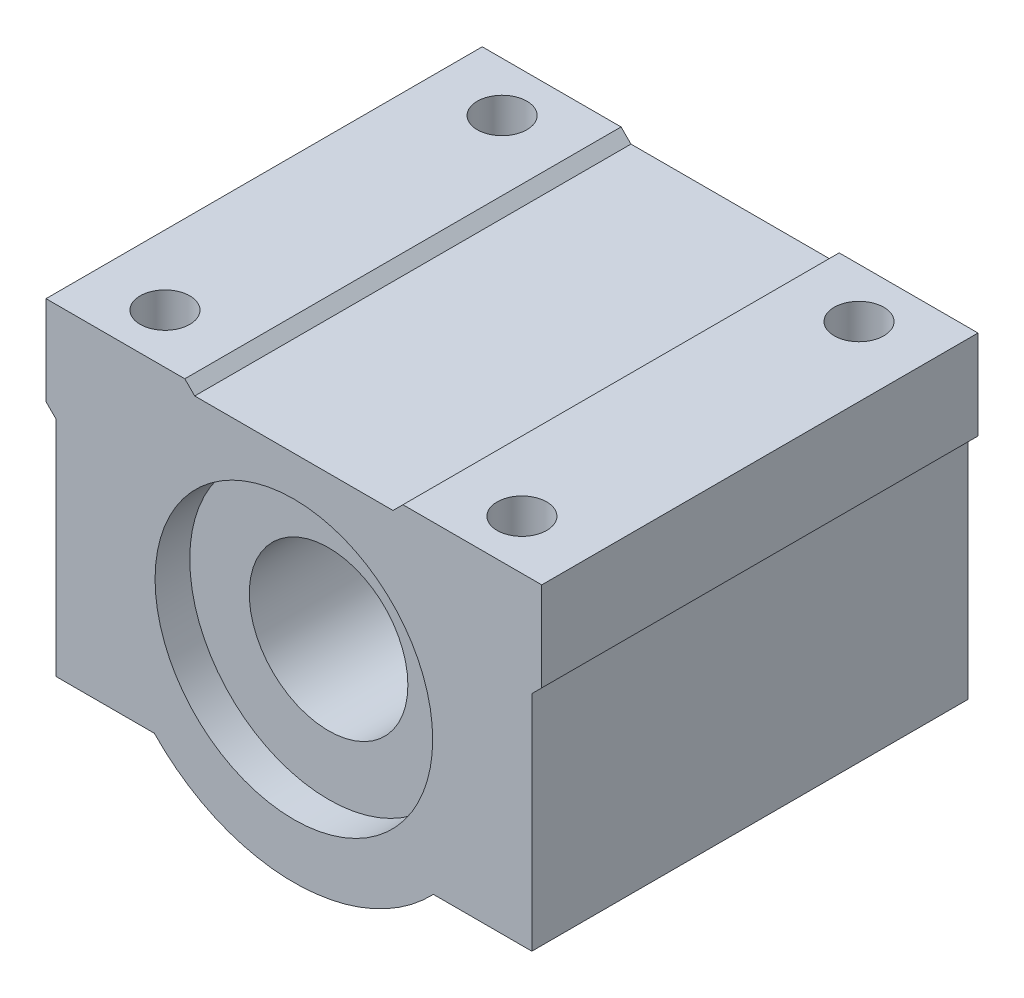
ISO-10303-21;
HEADER;
FILE_DESCRIPTION(('STEP AP214'),'2;1');
FILE_NAME('part.step','',(''),(''),'','','');
FILE_SCHEMA(('AUTOMOTIVE_DESIGN { 1 0 10303 214 1 1 1 1 }'));
ENDSEC;
DATA;
#1=APPLICATION_CONTEXT('core data for automotive mechanical design processes');
#2=APPLICATION_PROTOCOL_DEFINITION('international standard','automotive_design',2000,#1);
#3=PRODUCT_CONTEXT('',#1,'mechanical');
#4=PRODUCT('Part','Part','',(#3));
#5=PRODUCT_RELATED_PRODUCT_CATEGORY('part','',(#4));
#6=PRODUCT_DEFINITION_FORMATION('','',#4);
#7=PRODUCT_DEFINITION_CONTEXT('part definition',#1,'design');
#8=PRODUCT_DEFINITION('design','',#6,#7);
#9=PRODUCT_DEFINITION_SHAPE('','',#8);
#10=(LENGTH_UNIT() NAMED_UNIT(*) SI_UNIT(.MILLI.,.METRE.));
#11=(NAMED_UNIT(*) PLANE_ANGLE_UNIT() SI_UNIT($,.RADIAN.));
#12=(NAMED_UNIT(*) SI_UNIT($,.STERADIAN.) SOLID_ANGLE_UNIT());
#13=UNCERTAINTY_MEASURE_WITH_UNIT(LENGTH_MEASURE(1.E-05),#10,'distance_accuracy_value','');
#14=(GEOMETRIC_REPRESENTATION_CONTEXT(3) GLOBAL_UNCERTAINTY_ASSIGNED_CONTEXT((#13)) GLOBAL_UNIT_ASSIGNED_CONTEXT((#10,
#11,#12)) REPRESENTATION_CONTEXT('',''));
#15=CARTESIAN_POINT('',(0.,0.,0.));
#16=DIRECTION('',(0.,0.,1.));
#17=DIRECTION('',(1.,0.,0.));
#18=AXIS2_PLACEMENT_3D('',#15,#16,#17);
#19=CARTESIAN_POINT('',(9.29116685898119,22.1984733505311,18.5));
#20=DIRECTION('',(-0.707106781186548,0.707106781186548,0.));
#21=DIRECTION('',(-0.707106781186548,-0.707106781186548,0.));
#22=AXIS2_PLACEMENT_3D('',#19,#20,#21);
#23=PLANE('',#22);
#24=DIRECTION('',(-0.707106781186548,-0.707106781186548,0.));
#25=VECTOR('',#24,1.);
#26=CARTESIAN_POINT('',(9.29116685898119,22.1984733505311,-3.50000000000001));
#27=LINE('',#26,#25);
#28=CARTESIAN_POINT('',(10.2911668589812,23.1984733505311,-3.5));
#29=VERTEX_POINT('',#28);
#30=CARTESIAN_POINT('',(9.2911668589812,22.1984733505311,-3.50000000000001));
#31=VERTEX_POINT('',#30);
#32=EDGE_CURVE('E112',#29,#31,#27,.T.);
#33=ORIENTED_EDGE('',*,*,#32,.T.);
#34=DIRECTION('',(0.,0.,1.));
#35=VECTOR('',#34,1.);
#36=CARTESIAN_POINT('',(9.29116685898119,22.1984733505311,18.5));
#37=LINE('',#36,#35);
#38=CARTESIAN_POINT('',(9.2911668589812,22.1984733505311,40.5));
#39=VERTEX_POINT('',#38);
#40=EDGE_CURVE('E116',#39,#31,#37,.F.);
#41=ORIENTED_EDGE('',*,*,#40,.F.);
#42=DIRECTION('',(-0.707106781186548,-0.707106781186548,0.));
#43=VECTOR('',#42,1.);
#44=CARTESIAN_POINT('',(9.29116685898119,22.1984733505311,40.5));
#45=LINE('',#44,#43);
#46=CARTESIAN_POINT('',(10.2911668589812,23.1984733505311,40.5));
#47=VERTEX_POINT('',#46);
#48=EDGE_CURVE('E124',#39,#47,#45,.F.);
#49=ORIENTED_EDGE('',*,*,#48,.T.);
#50=DIRECTION('',(0.,0.,1.));
#51=VECTOR('',#50,1.);
#52=CARTESIAN_POINT('',(10.2911668589812,23.1984733505311,18.5));
#53=LINE('',#52,#51);
#54=EDGE_CURVE('E119',#29,#47,#53,.T.);
#55=ORIENTED_EDGE('',*,*,#54,.F.);
#56=EDGE_LOOP('',(#33,#41,#49,#55));
#57=FACE_BOUND('',#56,.T.);
#58=ADVANCED_FACE('F17',(#57),#23,.T.);
#59=CARTESIAN_POINT('',(-11.7088331410188,23.1984733505311,18.5));
#60=DIRECTION('',(0.707106781186546,0.707106781186549,0.));
#61=DIRECTION('',(-0.707106781186549,0.707106781186546,0.));
#62=AXIS2_PLACEMENT_3D('',#59,#60,#61);
#63=PLANE('',#62);
#64=DIRECTION('',(-0.707106781186549,0.707106781186546,0.));
#65=VECTOR('',#64,1.);
#66=CARTESIAN_POINT('',(-11.7088331410188,23.1984733505311,-3.5));
#67=LINE('',#66,#65);
#68=CARTESIAN_POINT('',(-10.7088331410188,22.1984733505311,-3.5));
#69=VERTEX_POINT('',#68);
#70=CARTESIAN_POINT('',(-11.7088331410188,23.1984733505311,-3.5));
#71=VERTEX_POINT('',#70);
#72=EDGE_CURVE('E138',#69,#71,#67,.T.);
#73=ORIENTED_EDGE('',*,*,#72,.T.);
#74=DIRECTION('',(0.,0.,1.));
#75=VECTOR('',#74,1.);
#76=CARTESIAN_POINT('',(-11.7088331410188,23.1984733505311,18.5));
#77=LINE('',#76,#75);
#78=CARTESIAN_POINT('',(-11.7088331410188,23.1984733505311,40.5));
#79=VERTEX_POINT('',#78);
#80=EDGE_CURVE('E183',#79,#71,#77,.F.);
#81=ORIENTED_EDGE('',*,*,#80,.F.);
#82=DIRECTION('',(-0.707106781186549,0.707106781186546,0.));
#83=VECTOR('',#82,1.);
#84=CARTESIAN_POINT('',(-11.7088331410188,23.1984733505311,40.5));
#85=LINE('',#84,#83);
#86=CARTESIAN_POINT('',(-10.7088331410188,22.1984733505311,40.5));
#87=VERTEX_POINT('',#86);
#88=EDGE_CURVE('E123',#79,#87,#85,.F.);
#89=ORIENTED_EDGE('',*,*,#88,.T.);
#90=DIRECTION('',(0.,0.,1.));
#91=VECTOR('',#90,1.);
#92=CARTESIAN_POINT('',(-10.7088331410188,22.1984733505311,18.5));
#93=LINE('',#92,#91);
#94=EDGE_CURVE('E133',#69,#87,#93,.T.);
#95=ORIENTED_EDGE('',*,*,#94,.F.);
#96=EDGE_LOOP('',(#73,#81,#89,#95));
#97=FACE_BOUND('',#96,.T.);
#98=ADVANCED_FACE('F397',(#97),#63,.T.);
#99=CARTESIAN_POINT('',(-24.7088331410188,13.1984733505311,18.5));
#100=DIRECTION('',(-0.707106781186543,-0.707106781186552,0.));
#101=DIRECTION('',(0.707106781186552,-0.707106781186543,0.));
#102=AXIS2_PLACEMENT_3D('',#99,#100,#101);
#103=PLANE('',#102);
#104=DIRECTION('',(0.707106781186552,-0.707106781186543,0.));
#105=VECTOR('',#104,1.);
#106=CARTESIAN_POINT('',(-24.7088331410188,13.1984733505311,-3.5));
#107=LINE('',#106,#105);
#108=CARTESIAN_POINT('',(-25.7088331410188,14.1984733505311,-3.5));
#109=VERTEX_POINT('',#108);
#110=CARTESIAN_POINT('',(-24.7088331410188,13.1984733505311,-3.5));
#111=VERTEX_POINT('',#110);
#112=EDGE_CURVE('E211',#109,#111,#107,.T.);
#113=ORIENTED_EDGE('',*,*,#112,.T.);
#114=DIRECTION('',(0.,0.,1.));
#115=VECTOR('',#114,1.);
#116=CARTESIAN_POINT('',(-24.7088331410188,13.1984733505311,18.5));
#117=LINE('',#116,#115);
#118=CARTESIAN_POINT('',(-24.7088331410188,13.1984733505311,40.5));
#119=VERTEX_POINT('',#118);
#120=EDGE_CURVE('E166',#119,#111,#117,.F.);
#121=ORIENTED_EDGE('',*,*,#120,.F.);
#122=DIRECTION('',(0.707106781186552,-0.707106781186543,0.));
#123=VECTOR('',#122,1.);
#124=CARTESIAN_POINT('',(-24.7088331410188,13.1984733505311,40.5));
#125=LINE('',#124,#123);
#126=CARTESIAN_POINT('',(-25.7088331410188,14.1984733505311,40.5));
#127=VERTEX_POINT('',#126);
#128=EDGE_CURVE('E212',#119,#127,#125,.F.);
#129=ORIENTED_EDGE('',*,*,#128,.T.);
#130=DIRECTION('',(0.,0.,1.));
#131=VECTOR('',#130,1.);
#132=CARTESIAN_POINT('',(-25.7088331410188,14.1984733505311,18.5));
#133=LINE('',#132,#131);
#134=EDGE_CURVE('E177',#109,#127,#133,.T.);
#135=ORIENTED_EDGE('',*,*,#134,.F.);
#136=EDGE_LOOP('',(#113,#121,#129,#135));
#137=FACE_BOUND('',#136,.T.);
#138=ADVANCED_FACE('F386',(#137),#103,.T.);
#139=CARTESIAN_POINT('',(-18.7088331410188,6.94847335053108,35.5));
#140=DIRECTION('',(0.,1.,0.));
#141=DIRECTION('',(0.,0.,1.));
#142=AXIS2_PLACEMENT_3D('',#139,#140,#141);
#143=CYLINDRICAL_SURFACE('',#142,2.5);
#144=CARTESIAN_POINT('',(-18.7088331410188,-9.30152664946892,35.5));
#145=DIRECTION('',(0.,1.,0.));
#146=DIRECTION('',(0.,0.,1.));
#147=AXIS2_PLACEMENT_3D('',#144,#145,#146);
#148=CIRCLE('',#147,2.5);
#149=CARTESIAN_POINT('',(-18.7088331410188,-9.30152664946892,38.));
#150=VERTEX_POINT('',#149);
#151=EDGE_CURVE('E165',#150,#150,#148,.T.);
#152=ORIENTED_EDGE('',*,*,#151,.F.);
#153=EDGE_LOOP('',(#152));
#154=FACE_BOUND('',#153,.T.);
#155=CARTESIAN_POINT('',(-18.7088331410188,23.1984733505311,35.5));
#156=DIRECTION('',(0.,1.,0.));
#157=DIRECTION('',(0.,0.,1.));
#158=AXIS2_PLACEMENT_3D('',#155,#156,#157);
#159=CIRCLE('',#158,2.5);
#160=CARTESIAN_POINT('',(-18.7088331410188,23.1984733505311,38.));
#161=VERTEX_POINT('',#160);
#162=EDGE_CURVE('E186',#161,#161,#159,.F.);
#163=ORIENTED_EDGE('',*,*,#162,.F.);
#164=EDGE_LOOP('',(#163));
#165=FACE_BOUND('',#164,.T.);
#166=ADVANCED_FACE('F287',(#154,#165),#143,.F.);
#167=CARTESIAN_POINT('',(-18.7088331410188,6.94847335053108,1.5));
#168=DIRECTION('',(0.,1.,0.));
#169=DIRECTION('',(0.,0.,1.));
#170=AXIS2_PLACEMENT_3D('',#167,#168,#169);
#171=CYLINDRICAL_SURFACE('',#170,2.5);
#172=CARTESIAN_POINT('',(-18.7088331410188,-9.30152664946892,1.5));
#173=DIRECTION('',(0.,1.,0.));
#174=DIRECTION('',(0.,0.,1.));
#175=AXIS2_PLACEMENT_3D('',#172,#173,#174);
#176=CIRCLE('',#175,2.5);
#177=CARTESIAN_POINT('',(-18.7088331410188,-9.30152664946892,4.));
#178=VERTEX_POINT('',#177);
#179=EDGE_CURVE('E162',#178,#178,#176,.T.);
#180=ORIENTED_EDGE('',*,*,#179,.F.);
#181=EDGE_LOOP('',(#180));
#182=FACE_BOUND('',#181,.T.);
#183=CARTESIAN_POINT('',(-18.7088331410188,23.1984733505311,1.5));
#184=DIRECTION('',(0.,1.,0.));
#185=DIRECTION('',(0.,0.,1.));
#186=AXIS2_PLACEMENT_3D('',#183,#184,#185);
#187=CIRCLE('',#186,2.5);
#188=CARTESIAN_POINT('',(-18.7088331410188,23.1984733505311,4.));
#189=VERTEX_POINT('',#188);
#190=EDGE_CURVE('E182',#189,#189,#187,.F.);
#191=ORIENTED_EDGE('',*,*,#190,.F.);
#192=EDGE_LOOP('',(#191));
#193=FACE_BOUND('',#192,.T.);
#194=ADVANCED_FACE('F276',(#182,#193),#171,.F.);
#195=CARTESIAN_POINT('',(17.2911668589812,6.94847335053109,1.5));
#196=DIRECTION('',(0.,1.,0.));
#197=DIRECTION('',(-1.,0.,0.));
#198=AXIS2_PLACEMENT_3D('',#195,#196,#197);
#199=CYLINDRICAL_SURFACE('',#198,2.5);
#200=CARTESIAN_POINT('',(17.2911668589812,-9.30152664946891,1.5));
#201=DIRECTION('',(0.,1.,0.));
#202=DIRECTION('',(-1.,0.,0.));
#203=AXIS2_PLACEMENT_3D('',#200,#201,#202);
#204=CIRCLE('',#203,2.5);
#205=CARTESIAN_POINT('',(14.7911668589812,-9.30152664946891,1.5));
#206=VERTEX_POINT('',#205);
#207=EDGE_CURVE('E151',#206,#206,#204,.T.);
#208=ORIENTED_EDGE('',*,*,#207,.F.);
#209=EDGE_LOOP('',(#208));
#210=FACE_BOUND('',#209,.T.);
#211=CARTESIAN_POINT('',(17.2911668589812,23.1984733505311,1.5));
#212=DIRECTION('',(0.,1.,0.));
#213=DIRECTION('',(-1.,0.,0.));
#214=AXIS2_PLACEMENT_3D('',#211,#212,#213);
#215=CIRCLE('',#214,2.5);
#216=CARTESIAN_POINT('',(14.7911668589812,23.1984733505311,1.5));
#217=VERTEX_POINT('',#216);
#218=EDGE_CURVE('E20',#217,#217,#215,.F.);
#219=ORIENTED_EDGE('',*,*,#218,.F.);
#220=EDGE_LOOP('',(#219));
#221=FACE_BOUND('',#220,.T.);
#222=ADVANCED_FACE('F273',(#210,#221),#199,.F.);
#223=CARTESIAN_POINT('',(17.2911668589812,6.94847335053109,35.5));
#224=DIRECTION('',(0.,1.,0.));
#225=DIRECTION('',(-1.,0.,0.));
#226=AXIS2_PLACEMENT_3D('',#223,#224,#225);
#227=CYLINDRICAL_SURFACE('',#226,2.5);
#228=CARTESIAN_POINT('',(17.2911668589812,-9.30152664946891,35.5));
#229=DIRECTION('',(0.,1.,0.));
#230=DIRECTION('',(-1.,0.,0.));
#231=AXIS2_PLACEMENT_3D('',#228,#229,#230);
#232=CIRCLE('',#231,2.5);
#233=CARTESIAN_POINT('',(14.7911668589812,-9.30152664946891,35.5));
#234=VERTEX_POINT('',#233);
#235=EDGE_CURVE('E153',#234,#234,#232,.T.);
#236=ORIENTED_EDGE('',*,*,#235,.F.);
#237=EDGE_LOOP('',(#236));
#238=FACE_BOUND('',#237,.T.);
#239=CARTESIAN_POINT('',(17.2911668589812,23.1984733505311,35.5));
#240=DIRECTION('',(0.,1.,0.));
#241=DIRECTION('',(-1.,0.,0.));
#242=AXIS2_PLACEMENT_3D('',#239,#240,#241);
#243=CIRCLE('',#242,2.5);
#244=CARTESIAN_POINT('',(14.7911668589812,23.1984733505311,35.5));
#245=VERTEX_POINT('',#244);
#246=EDGE_CURVE('E134',#245,#245,#243,.F.);
#247=ORIENTED_EDGE('',*,*,#246,.F.);
#248=EDGE_LOOP('',(#247));
#249=FACE_BOUND('',#248,.T.);
#250=ADVANCED_FACE('F275',(#238,#249),#227,.F.);
#251=CARTESIAN_POINT('',(24.2911668589812,14.1984733505311,18.5));
#252=DIRECTION('',(0.707106781186549,-0.707106781186546,0.));
#253=DIRECTION('',(0.707106781186546,0.707106781186549,0.));
#254=AXIS2_PLACEMENT_3D('',#251,#252,#253);
#255=PLANE('',#254);
#256=DIRECTION('',(0.707106781186546,0.707106781186549,0.));
#257=VECTOR('',#256,1.);
#258=CARTESIAN_POINT('',(24.2911668589812,14.1984733505311,-3.5));
#259=LINE('',#258,#257);
#260=CARTESIAN_POINT('',(23.2911668589812,13.1984733505311,-3.5));
#261=VERTEX_POINT('',#260);
#262=CARTESIAN_POINT('',(24.2911668589812,14.1984733505311,-3.5));
#263=VERTEX_POINT('',#262);
#264=EDGE_CURVE('E91',#261,#263,#259,.T.);
#265=ORIENTED_EDGE('',*,*,#264,.T.);
#266=DIRECTION('',(0.,0.,-1.));
#267=VECTOR('',#266,1.);
#268=CARTESIAN_POINT('',(24.2911668589812,14.1984733505311,18.5));
#269=LINE('',#268,#267);
#270=CARTESIAN_POINT('',(24.2911668589812,14.1984733505311,40.5));
#271=VERTEX_POINT('',#270);
#272=EDGE_CURVE('E192',#271,#263,#269,.T.);
#273=ORIENTED_EDGE('',*,*,#272,.F.);
#274=DIRECTION('',(0.707106781186546,0.707106781186549,0.));
#275=VECTOR('',#274,1.);
#276=CARTESIAN_POINT('',(24.2911668589812,14.1984733505311,40.5));
#277=LINE('',#276,#275);
#278=CARTESIAN_POINT('',(23.2911668589812,13.1984733505311,40.5));
#279=VERTEX_POINT('',#278);
#280=EDGE_CURVE('E208',#271,#279,#277,.F.);
#281=ORIENTED_EDGE('',*,*,#280,.T.);
#282=DIRECTION('',(0.,0.,-1.));
#283=VECTOR('',#282,1.);
#284=CARTESIAN_POINT('',(23.2911668589812,13.1984733505311,18.5));
#285=LINE('',#284,#283);
#286=EDGE_CURVE('E141',#261,#279,#285,.F.);
#287=ORIENTED_EDGE('',*,*,#286,.F.);
#288=EDGE_LOOP('',(#265,#273,#281,#287));
#289=FACE_BOUND('',#288,.T.);
#290=ADVANCED_FACE('F284',(#289),#255,.T.);
#291=CARTESIAN_POINT('',(24.2911668589812,23.1984733505311,18.5));
#292=DIRECTION('',(1.,0.,0.));
#293=DIRECTION('',(0.,0.,-1.));
#294=AXIS2_PLACEMENT_3D('',#291,#292,#293);
#295=PLANE('',#294);
#296=DIRECTION('',(0.,1.,0.));
#297=VECTOR('',#296,1.);
#298=CARTESIAN_POINT('',(24.2911668589812,6.14233781535583,-3.5));
#299=LINE('',#298,#297);
#300=CARTESIAN_POINT('',(24.2911668589812,23.1984733505311,-3.5));
#301=VERTEX_POINT('',#300);
#302=EDGE_CURVE('E197',#263,#301,#299,.T.);
#303=ORIENTED_EDGE('',*,*,#302,.T.);
#304=DIRECTION('',(0.,0.,1.));
#305=VECTOR('',#304,1.);
#306=CARTESIAN_POINT('',(24.2911668589812,23.1984733505311,18.5));
#307=LINE('',#306,#305);
#308=CARTESIAN_POINT('',(24.2911668589812,23.1984733505311,40.5));
#309=VERTEX_POINT('',#308);
#310=EDGE_CURVE('E189',#309,#301,#307,.F.);
#311=ORIENTED_EDGE('',*,*,#310,.F.);
#312=DIRECTION('',(0.,1.,0.));
#313=VECTOR('',#312,1.);
#314=CARTESIAN_POINT('',(24.2911668589812,6.14233781535582,40.5));
#315=LINE('',#314,#313);
#316=EDGE_CURVE('E367',#271,#309,#315,.T.);
#317=ORIENTED_EDGE('',*,*,#316,.F.);
#318=ORIENTED_EDGE('',*,*,#272,.T.);
#319=EDGE_LOOP('',(#303,#311,#317,#318));
#320=FACE_BOUND('',#319,.T.);
#321=ADVANCED_FACE('F353',(#320),#295,.T.);
#322=CARTESIAN_POINT('',(10.2911668589812,23.1984733505311,18.5));
#323=DIRECTION('',(0.,1.,0.));
#324=DIRECTION('',(0.,0.,1.));
#325=AXIS2_PLACEMENT_3D('',#322,#323,#324);
#326=PLANE('',#325);
#327=ORIENTED_EDGE('',*,*,#246,.T.);
#328=EDGE_LOOP('',(#327));
#329=FACE_BOUND('',#328,.T.);
#330=ORIENTED_EDGE('',*,*,#218,.T.);
#331=EDGE_LOOP('',(#330));
#332=FACE_BOUND('',#331,.T.);
#333=DIRECTION('',(1.,0.,0.));
#334=VECTOR('',#333,1.);
#335=CARTESIAN_POINT('',(-0.708833141018809,23.1984733505311,-3.5));
#336=LINE('',#335,#334);
#337=EDGE_CURVE('E368',#301,#29,#336,.F.);
#338=ORIENTED_EDGE('',*,*,#337,.T.);
#339=ORIENTED_EDGE('',*,*,#54,.T.);
#340=DIRECTION('',(1.,0.,0.));
#341=VECTOR('',#340,1.);
#342=CARTESIAN_POINT('',(-0.708833141018808,23.1984733505311,40.5));
#343=LINE('',#342,#341);
#344=EDGE_CURVE('E415',#309,#47,#343,.F.);
#345=ORIENTED_EDGE('',*,*,#344,.F.);
#346=ORIENTED_EDGE('',*,*,#310,.T.);
#347=EDGE_LOOP('',(#338,#339,#345,#346));
#348=FACE_BOUND('',#347,.T.);
#349=ADVANCED_FACE('F270',(#329,#332,#348),#326,.T.);
#350=CARTESIAN_POINT('',(-10.7088331410188,22.1984733505311,18.5));
#351=DIRECTION('',(0.,1.,0.));
#352=DIRECTION('',(0.,0.,1.));
#353=AXIS2_PLACEMENT_3D('',#350,#351,#352);
#354=PLANE('',#353);
#355=DIRECTION('',(1.,0.,0.));
#356=VECTOR('',#355,1.);
#357=CARTESIAN_POINT('',(-0.708833141018809,22.1984733505311,-3.5));
#358=LINE('',#357,#356);
#359=EDGE_CURVE('E130',#31,#69,#358,.F.);
#360=ORIENTED_EDGE('',*,*,#359,.T.);
#361=ORIENTED_EDGE('',*,*,#94,.T.);
#362=DIRECTION('',(1.,0.,0.));
#363=VECTOR('',#362,1.);
#364=CARTESIAN_POINT('',(-0.708833141018808,22.1984733505311,40.5));
#365=LINE('',#364,#363);
#366=EDGE_CURVE('E132',#39,#87,#365,.F.);
#367=ORIENTED_EDGE('',*,*,#366,.F.);
#368=ORIENTED_EDGE('',*,*,#40,.T.);
#369=EDGE_LOOP('',(#360,#361,#367,#368));
#370=FACE_BOUND('',#369,.T.);
#371=ADVANCED_FACE('F128',(#370),#354,.T.);
#372=CARTESIAN_POINT('',(-25.7088331410188,23.1984733505311,18.5));
#373=DIRECTION('',(0.,1.,0.));
#374=DIRECTION('',(0.,0.,1.));
#375=AXIS2_PLACEMENT_3D('',#372,#373,#374);
#376=PLANE('',#375);
#377=ORIENTED_EDGE('',*,*,#190,.T.);
#378=EDGE_LOOP('',(#377));
#379=FACE_BOUND('',#378,.T.);
#380=ORIENTED_EDGE('',*,*,#162,.T.);
#381=EDGE_LOOP('',(#380));
#382=FACE_BOUND('',#381,.T.);
#383=DIRECTION('',(1.,0.,0.));
#384=VECTOR('',#383,1.);
#385=CARTESIAN_POINT('',(-0.708833141018809,23.1984733505311,-3.5));
#386=LINE('',#385,#384);
#387=CARTESIAN_POINT('',(-25.7088331410188,23.1984733505311,-3.5));
#388=VERTEX_POINT('',#387);
#389=EDGE_CURVE('E140',#71,#388,#386,.F.);
#390=ORIENTED_EDGE('',*,*,#389,.T.);
#391=DIRECTION('',(0.,0.,1.));
#392=VECTOR('',#391,1.);
#393=CARTESIAN_POINT('',(-25.7088331410188,23.1984733505311,18.5));
#394=LINE('',#393,#392);
#395=CARTESIAN_POINT('',(-25.7088331410188,23.1984733505311,40.5));
#396=VERTEX_POINT('',#395);
#397=EDGE_CURVE('E180',#396,#388,#394,.F.);
#398=ORIENTED_EDGE('',*,*,#397,.F.);
#399=DIRECTION('',(1.,0.,0.));
#400=VECTOR('',#399,1.);
#401=CARTESIAN_POINT('',(-0.708833141018808,23.1984733505311,40.5));
#402=LINE('',#401,#400);
#403=EDGE_CURVE('E233',#79,#396,#402,.F.);
#404=ORIENTED_EDGE('',*,*,#403,.F.);
#405=ORIENTED_EDGE('',*,*,#80,.T.);
#406=EDGE_LOOP('',(#390,#398,#404,#405));
#407=FACE_BOUND('',#406,.T.);
#408=ADVANCED_FACE('F344',(#379,#382,#407),#376,.T.);
#409=CARTESIAN_POINT('',(-25.7088331410188,14.1984733505311,18.5));
#410=DIRECTION('',(-1.,0.,0.));
#411=DIRECTION('',(0.,0.,1.));
#412=AXIS2_PLACEMENT_3D('',#409,#410,#411);
#413=PLANE('',#412);
#414=DIRECTION('',(0.,1.,0.));
#415=VECTOR('',#414,1.);
#416=CARTESIAN_POINT('',(-25.7088331410188,6.14233781535583,-3.5));
#417=LINE('',#416,#415);
#418=EDGE_CURVE('E144',#388,#109,#417,.F.);
#419=ORIENTED_EDGE('',*,*,#418,.T.);
#420=ORIENTED_EDGE('',*,*,#134,.T.);
#421=DIRECTION('',(0.,1.,0.));
#422=VECTOR('',#421,1.);
#423=CARTESIAN_POINT('',(-25.7088331410188,6.14233781535582,40.5));
#424=LINE('',#423,#422);
#425=EDGE_CURVE('E172',#396,#127,#424,.F.);
#426=ORIENTED_EDGE('',*,*,#425,.F.);
#427=ORIENTED_EDGE('',*,*,#397,.T.);
#428=EDGE_LOOP('',(#419,#420,#426,#427));
#429=FACE_BOUND('',#428,.T.);
#430=ADVANCED_FACE('F340',(#429),#413,.T.);
#431=CARTESIAN_POINT('',(-24.7088331410188,-9.30152664946893,18.5));
#432=DIRECTION('',(-1.,0.,0.));
#433=DIRECTION('',(0.,0.,1.));
#434=AXIS2_PLACEMENT_3D('',#431,#432,#433);
#435=PLANE('',#434);
#436=DIRECTION('',(0.,1.,0.));
#437=VECTOR('',#436,1.);
#438=CARTESIAN_POINT('',(-24.7088331410188,6.14233781535583,-3.5));
#439=LINE('',#438,#437);
#440=CARTESIAN_POINT('',(-24.7088331410188,-9.30152664946892,-3.5));
#441=VERTEX_POINT('',#440);
#442=EDGE_CURVE('E201',#111,#441,#439,.F.);
#443=ORIENTED_EDGE('',*,*,#442,.T.);
#444=DIRECTION('',(0.,0.,-1.));
#445=VECTOR('',#444,1.);
#446=CARTESIAN_POINT('',(-24.7088331410188,-9.30152664946892,18.5));
#447=LINE('',#446,#445);
#448=CARTESIAN_POINT('',(-24.7088331410188,-9.30152664946893,40.5));
#449=VERTEX_POINT('',#448);
#450=EDGE_CURVE('E163',#449,#441,#447,.T.);
#451=ORIENTED_EDGE('',*,*,#450,.F.);
#452=DIRECTION('',(0.,1.,0.));
#453=VECTOR('',#452,1.);
#454=CARTESIAN_POINT('',(-24.7088331410188,6.14233781535582,40.5));
#455=LINE('',#454,#453);
#456=EDGE_CURVE('E169',#119,#449,#455,.F.);
#457=ORIENTED_EDGE('',*,*,#456,.F.);
#458=ORIENTED_EDGE('',*,*,#120,.T.);
#459=EDGE_LOOP('',(#443,#451,#457,#458));
#460=FACE_BOUND('',#459,.T.);
#461=ADVANCED_FACE('F336',(#460),#435,.T.);
#462=CARTESIAN_POINT('',(-14.7800804204891,-9.30152664946892,18.5));
#463=DIRECTION('',(0.,-1.,0.));
#464=DIRECTION('',(0.,0.,-1.));
#465=AXIS2_PLACEMENT_3D('',#462,#463,#464);
#466=PLANE('',#465);
#467=ORIENTED_EDGE('',*,*,#179,.T.);
#468=EDGE_LOOP('',(#467));
#469=FACE_BOUND('',#468,.T.);
#470=ORIENTED_EDGE('',*,*,#151,.T.);
#471=EDGE_LOOP('',(#470));
#472=FACE_BOUND('',#471,.T.);
#473=DIRECTION('',(1.,0.,0.));
#474=VECTOR('',#473,1.);
#475=CARTESIAN_POINT('',(-0.708833141018809,-9.30152664946892,-3.5));
#476=LINE('',#475,#474);
#477=CARTESIAN_POINT('',(-14.7800804204891,-9.30152664946893,-3.5));
#478=VERTEX_POINT('',#477);
#479=EDGE_CURVE('E204',#441,#478,#476,.T.);
#480=ORIENTED_EDGE('',*,*,#479,.T.);
#481=DIRECTION('',(0.,0.,1.));
#482=VECTOR('',#481,1.);
#483=CARTESIAN_POINT('',(-14.7800804204891,-9.30152664946893,18.5));
#484=LINE('',#483,#482);
#485=CARTESIAN_POINT('',(-14.7800804204891,-9.30152664946893,40.5));
#486=VERTEX_POINT('',#485);
#487=EDGE_CURVE('E70',#486,#478,#484,.F.);
#488=ORIENTED_EDGE('',*,*,#487,.F.);
#489=DIRECTION('',(1.,0.,0.));
#490=VECTOR('',#489,1.);
#491=CARTESIAN_POINT('',(-0.708833141018808,-9.30152664946893,40.5));
#492=LINE('',#491,#490);
#493=EDGE_CURVE('E171',#449,#486,#492,.T.);
#494=ORIENTED_EDGE('',*,*,#493,.F.);
#495=ORIENTED_EDGE('',*,*,#450,.T.);
#496=EDGE_LOOP('',(#480,#488,#494,#495));
#497=FACE_BOUND('',#496,.T.);
#498=ADVANCED_FACE('F333',(#469,#472,#497),#466,.T.);
#499=CARTESIAN_POINT('',(-0.708833141018808,4.19847335053108,18.5));
#500=DIRECTION('',(0.,0.,1.));
#501=DIRECTION('',(1.,0.,0.));
#502=AXIS2_PLACEMENT_3D('',#499,#500,#501);
#503=CYLINDRICAL_SURFACE('',#502,19.5);
#504=CARTESIAN_POINT('',(-0.708833141018808,4.19847335053108,-3.5));
#505=DIRECTION('',(0.,0.,1.));
#506=DIRECTION('',(1.,0.,0.));
#507=AXIS2_PLACEMENT_3D('',#504,#505,#506);
#508=CIRCLE('',#507,19.5);
#509=CARTESIAN_POINT('',(13.3624141384515,-9.30152664946891,-3.5));
#510=VERTEX_POINT('',#509);
#511=EDGE_CURVE('E251',#478,#510,#508,.T.);
#512=ORIENTED_EDGE('',*,*,#511,.T.);
#513=DIRECTION('',(0.,0.,-1.));
#514=VECTOR('',#513,1.);
#515=CARTESIAN_POINT('',(13.3624141384515,-9.30152664946891,18.5));
#516=LINE('',#515,#514);
#517=CARTESIAN_POINT('',(13.3624141384515,-9.30152664946891,40.5));
#518=VERTEX_POINT('',#517);
#519=EDGE_CURVE('E76',#518,#510,#516,.T.);
#520=ORIENTED_EDGE('',*,*,#519,.F.);
#521=CARTESIAN_POINT('',(-0.708833141018808,4.19847335053108,40.5));
#522=DIRECTION('',(0.,0.,1.));
#523=DIRECTION('',(1.,0.,0.));
#524=AXIS2_PLACEMENT_3D('',#521,#522,#523);
#525=CIRCLE('',#524,19.5);
#526=EDGE_CURVE('E249',#486,#518,#525,.T.);
#527=ORIENTED_EDGE('',*,*,#526,.F.);
#528=ORIENTED_EDGE('',*,*,#487,.T.);
#529=EDGE_LOOP('',(#512,#520,#527,#528));
#530=FACE_BOUND('',#529,.T.);
#531=ADVANCED_FACE('F329',(#530),#503,.T.);
#532=CARTESIAN_POINT('',(23.2911668589812,-9.30152664946891,18.5));
#533=DIRECTION('',(0.,-1.,0.));
#534=DIRECTION('',(0.,0.,-1.));
#535=AXIS2_PLACEMENT_3D('',#532,#533,#534);
#536=PLANE('',#535);
#537=ORIENTED_EDGE('',*,*,#235,.T.);
#538=EDGE_LOOP('',(#537));
#539=FACE_BOUND('',#538,.T.);
#540=ORIENTED_EDGE('',*,*,#207,.T.);
#541=EDGE_LOOP('',(#540));
#542=FACE_BOUND('',#541,.T.);
#543=DIRECTION('',(1.,0.,0.));
#544=VECTOR('',#543,1.);
#545=CARTESIAN_POINT('',(-0.708833141018809,-9.30152664946891,-3.5));
#546=LINE('',#545,#544);
#547=CARTESIAN_POINT('',(23.2911668589812,-9.30152664946891,-3.5));
#548=VERTEX_POINT('',#547);
#549=EDGE_CURVE('E198',#510,#548,#546,.T.);
#550=ORIENTED_EDGE('',*,*,#549,.T.);
#551=DIRECTION('',(0.,0.,-1.));
#552=VECTOR('',#551,1.);
#553=CARTESIAN_POINT('',(23.2911668589812,-9.30152664946891,18.5));
#554=LINE('',#553,#552);
#555=CARTESIAN_POINT('',(23.2911668589812,-9.30152664946892,40.5));
#556=VERTEX_POINT('',#555);
#557=EDGE_CURVE('E83',#556,#548,#554,.T.);
#558=ORIENTED_EDGE('',*,*,#557,.F.);
#559=DIRECTION('',(1.,0.,0.));
#560=VECTOR('',#559,1.);
#561=CARTESIAN_POINT('',(-0.708833141018808,-9.30152664946892,40.5));
#562=LINE('',#561,#560);
#563=EDGE_CURVE('E35',#518,#556,#562,.T.);
#564=ORIENTED_EDGE('',*,*,#563,.F.);
#565=ORIENTED_EDGE('',*,*,#519,.T.);
#566=EDGE_LOOP('',(#550,#558,#564,#565));
#567=FACE_BOUND('',#566,.T.);
#568=ADVANCED_FACE('F326',(#539,#542,#567),#536,.T.);
#569=CARTESIAN_POINT('',(23.2911668589812,13.1984733505311,18.5));
#570=DIRECTION('',(1.,0.,0.));
#571=DIRECTION('',(0.,0.,-1.));
#572=AXIS2_PLACEMENT_3D('',#569,#570,#571);
#573=PLANE('',#572);
#574=DIRECTION('',(0.,1.,0.));
#575=VECTOR('',#574,1.);
#576=CARTESIAN_POINT('',(23.2911668589812,6.14233781535583,-3.5));
#577=LINE('',#576,#575);
#578=EDGE_CURVE('E195',#548,#261,#577,.T.);
#579=ORIENTED_EDGE('',*,*,#578,.T.);
#580=ORIENTED_EDGE('',*,*,#286,.T.);
#581=DIRECTION('',(0.,1.,0.));
#582=VECTOR('',#581,1.);
#583=CARTESIAN_POINT('',(23.2911668589812,6.14233781535582,40.5));
#584=LINE('',#583,#582);
#585=EDGE_CURVE('E156',#556,#279,#584,.T.);
#586=ORIENTED_EDGE('',*,*,#585,.F.);
#587=ORIENTED_EDGE('',*,*,#557,.T.);
#588=EDGE_LOOP('',(#579,#580,#586,#587));
#589=FACE_BOUND('',#588,.T.);
#590=ADVANCED_FACE('F322',(#589),#573,.T.);
#591=CARTESIAN_POINT('',(-0.708833141018809,6.14233781535583,-3.5));
#592=DIRECTION('',(0.,0.,1.));
#593=DIRECTION('',(1.,0.,0.));
#594=AXIS2_PLACEMENT_3D('',#591,#592,#593);
#595=PLANE('',#594);
#596=CARTESIAN_POINT('',(-0.708833141018808,4.19847335053108,-3.5));
#597=DIRECTION('',(0.,0.,1.));
#598=DIRECTION('',(1.,0.,0.));
#599=AXIS2_PLACEMENT_3D('',#596,#597,#598);
#600=CIRCLE('',#599,14.);
#601=CARTESIAN_POINT('',(13.2911668589812,4.19847335053108,-3.5));
#602=VERTEX_POINT('',#601);
#603=EDGE_CURVE('E158',#602,#602,#600,.T.);
#604=ORIENTED_EDGE('',*,*,#603,.T.);
#605=EDGE_LOOP('',(#604));
#606=FACE_BOUND('',#605,.T.);
#607=ORIENTED_EDGE('',*,*,#302,.F.);
#608=ORIENTED_EDGE('',*,*,#264,.F.);
#609=ORIENTED_EDGE('',*,*,#578,.F.);
#610=ORIENTED_EDGE('',*,*,#549,.F.);
#611=ORIENTED_EDGE('',*,*,#511,.F.);
#612=ORIENTED_EDGE('',*,*,#479,.F.);
#613=ORIENTED_EDGE('',*,*,#442,.F.);
#614=ORIENTED_EDGE('',*,*,#112,.F.);
#615=ORIENTED_EDGE('',*,*,#418,.F.);
#616=ORIENTED_EDGE('',*,*,#389,.F.);
#617=ORIENTED_EDGE('',*,*,#72,.F.);
#618=ORIENTED_EDGE('',*,*,#359,.F.);
#619=ORIENTED_EDGE('',*,*,#32,.F.);
#620=ORIENTED_EDGE('',*,*,#337,.F.);
#621=EDGE_LOOP('',(#607,#608,#609,#610,#611,#612,#613,#614,#615,#616,#617,#618,#619,#620));
#622=FACE_BOUND('',#621,.T.);
#623=ADVANCED_FACE('F136',(#606,#622),#595,.F.);
#624=CARTESIAN_POINT('',(-0.708833141018808,6.14233781535582,40.5));
#625=DIRECTION('',(0.,0.,1.));
#626=DIRECTION('',(1.,0.,0.));
#627=AXIS2_PLACEMENT_3D('',#624,#625,#626);
#628=PLANE('',#627);
#629=CARTESIAN_POINT('',(-0.708833141018808,4.19847335053108,40.5));
#630=DIRECTION('',(0.,0.,1.));
#631=DIRECTION('',(1.,0.,0.));
#632=AXIS2_PLACEMENT_3D('',#629,#630,#631);
#633=CIRCLE('',#632,14.);
#634=CARTESIAN_POINT('',(13.2911668589812,4.19847335053108,40.5));
#635=VERTEX_POINT('',#634);
#636=EDGE_CURVE('E244',#635,#635,#633,.F.);
#637=ORIENTED_EDGE('',*,*,#636,.T.);
#638=EDGE_LOOP('',(#637));
#639=FACE_BOUND('',#638,.T.);
#640=ORIENTED_EDGE('',*,*,#563,.T.);
#641=ORIENTED_EDGE('',*,*,#585,.T.);
#642=ORIENTED_EDGE('',*,*,#280,.F.);
#643=ORIENTED_EDGE('',*,*,#316,.T.);
#644=ORIENTED_EDGE('',*,*,#344,.T.);
#645=ORIENTED_EDGE('',*,*,#48,.F.);
#646=ORIENTED_EDGE('',*,*,#366,.T.);
#647=ORIENTED_EDGE('',*,*,#88,.F.);
#648=ORIENTED_EDGE('',*,*,#403,.T.);
#649=ORIENTED_EDGE('',*,*,#425,.T.);
#650=ORIENTED_EDGE('',*,*,#128,.F.);
#651=ORIENTED_EDGE('',*,*,#456,.T.);
#652=ORIENTED_EDGE('',*,*,#493,.T.);
#653=ORIENTED_EDGE('',*,*,#526,.T.);
#654=EDGE_LOOP('',(#640,#641,#642,#643,#644,#645,#646,#647,#648,#649,#650,#651,#652,#653));
#655=FACE_BOUND('',#654,.T.);
#656=ADVANCED_FACE('F315',(#639,#655),#628,.T.);
#657=CARTESIAN_POINT('',(-0.708833141018808,4.19847335053108,18.5));
#658=DIRECTION('',(0.,0.,1.));
#659=DIRECTION('',(1.,0.,0.));
#660=AXIS2_PLACEMENT_3D('',#657,#658,#659);
#661=CYLINDRICAL_SURFACE('',#660,14.);
#662=CARTESIAN_POINT('',(-0.708833141018808,4.19847335053108,0.));
#663=DIRECTION('',(0.,0.,1.));
#664=DIRECTION('',(1.,0.,0.));
#665=AXIS2_PLACEMENT_3D('',#662,#663,#664);
#666=CIRCLE('',#665,14.);
#667=CARTESIAN_POINT('',(13.2911668589812,4.19847335053108,0.));
#668=VERTEX_POINT('',#667);
#669=EDGE_CURVE('E241',#668,#668,#666,.F.);
#670=ORIENTED_EDGE('',*,*,#669,.F.);
#671=EDGE_LOOP('',(#670));
#672=FACE_BOUND('',#671,.T.);
#673=ORIENTED_EDGE('',*,*,#603,.F.);
#674=EDGE_LOOP('',(#673));
#675=FACE_BOUND('',#674,.T.);
#676=ADVANCED_FACE('F311',(#672,#675),#661,.F.);
#677=CARTESIAN_POINT('',(-0.708833141018808,4.19847335053108,18.5));
#678=DIRECTION('',(0.,0.,1.));
#679=DIRECTION('',(1.,0.,0.));
#680=AXIS2_PLACEMENT_3D('',#677,#678,#679);
#681=CYLINDRICAL_SURFACE('',#680,14.);
#682=ORIENTED_EDGE('',*,*,#636,.F.);
#683=EDGE_LOOP('',(#682));
#684=FACE_BOUND('',#683,.T.);
#685=CARTESIAN_POINT('',(-0.708833141018808,4.19847335053108,37.));
#686=DIRECTION('',(0.,0.,1.));
#687=DIRECTION('',(1.,0.,0.));
#688=AXIS2_PLACEMENT_3D('',#685,#686,#687);
#689=CIRCLE('',#688,14.);
#690=CARTESIAN_POINT('',(13.2911668589812,4.19847335053108,37.));
#691=VERTEX_POINT('',#690);
#692=EDGE_CURVE('E238',#691,#691,#689,.F.);
#693=ORIENTED_EDGE('',*,*,#692,.T.);
#694=EDGE_LOOP('',(#693));
#695=FACE_BOUND('',#694,.T.);
#696=ADVANCED_FACE('F307',(#684,#695),#681,.F.);
#697=CARTESIAN_POINT('',(-0.708833141018808,4.19847335053108,0.));
#698=DIRECTION('',(0.,0.,-1.));
#699=DIRECTION('',(-1.,0.,0.));
#700=AXIS2_PLACEMENT_3D('',#697,#698,#699);
#701=PLANE('',#700);
#702=CARTESIAN_POINT('',(-0.708833141018808,4.19847335053108,0.));
#703=DIRECTION('',(0.,0.,1.));
#704=DIRECTION('',(1.,0.,0.));
#705=AXIS2_PLACEMENT_3D('',#702,#703,#704);
#706=CIRCLE('',#705,8.);
#707=CARTESIAN_POINT('',(7.29116685898119,4.19847335053108,0.));
#708=VERTEX_POINT('',#707);
#709=EDGE_CURVE('E26',#708,#708,#706,.T.);
#710=ORIENTED_EDGE('',*,*,#709,.T.);
#711=EDGE_LOOP('',(#710));
#712=FACE_BOUND('',#711,.T.);
#713=ORIENTED_EDGE('',*,*,#669,.T.);
#714=EDGE_LOOP('',(#713));
#715=FACE_BOUND('',#714,.T.);
#716=ADVANCED_FACE('F299',(#712,#715),#701,.T.);
#717=CARTESIAN_POINT('',(-0.708833141018808,4.19847335053108,37.));
#718=DIRECTION('',(0.,0.,-1.));
#719=DIRECTION('',(-1.,0.,0.));
#720=AXIS2_PLACEMENT_3D('',#717,#718,#719);
#721=PLANE('',#720);
#722=CARTESIAN_POINT('',(-0.708833141018808,4.19847335053108,37.));
#723=DIRECTION('',(0.,0.,1.));
#724=DIRECTION('',(1.,0.,0.));
#725=AXIS2_PLACEMENT_3D('',#722,#723,#724);
#726=CIRCLE('',#725,8.);
#727=CARTESIAN_POINT('',(7.29116685898119,4.19847335053108,37.));
#728=VERTEX_POINT('',#727);
#729=EDGE_CURVE('E11',#728,#728,#726,.F.);
#730=ORIENTED_EDGE('',*,*,#729,.T.);
#731=EDGE_LOOP('',(#730));
#732=FACE_BOUND('',#731,.T.);
#733=ORIENTED_EDGE('',*,*,#692,.F.);
#734=EDGE_LOOP('',(#733));
#735=FACE_BOUND('',#734,.T.);
#736=ADVANCED_FACE('F293',(#732,#735),#721,.F.);
#737=CARTESIAN_POINT('',(-0.708833141018808,4.19847335053108,0.));
#738=DIRECTION('',(0.,0.,1.));
#739=DIRECTION('',(1.,0.,0.));
#740=AXIS2_PLACEMENT_3D('',#737,#738,#739);
#741=CYLINDRICAL_SURFACE('',#740,8.);
#742=ORIENTED_EDGE('',*,*,#729,.F.);
#743=EDGE_LOOP('',(#742));
#744=FACE_BOUND('',#743,.T.);
#745=ORIENTED_EDGE('',*,*,#709,.F.);
#746=EDGE_LOOP('',(#745));
#747=FACE_BOUND('',#746,.T.);
#748=ADVANCED_FACE('F291',(#744,#747),#741,.F.);
#749=CLOSED_SHELL('',(#58,#98,#138,#166,#194,#222,#250,#290,#321,#349,#371,#408,#430,#461,#498,
#531,#568,#590,#623,#656,#676,#696,#716,#736,#748));
#750=MANIFOLD_SOLID_BREP('B1',#749);
#751=ADVANCED_BREP_SHAPE_REPRESENTATION('',(#18,#750),#14);
#752=SHAPE_DEFINITION_REPRESENTATION(#9,#751);
ENDSEC;
END-ISO-10303-21;
